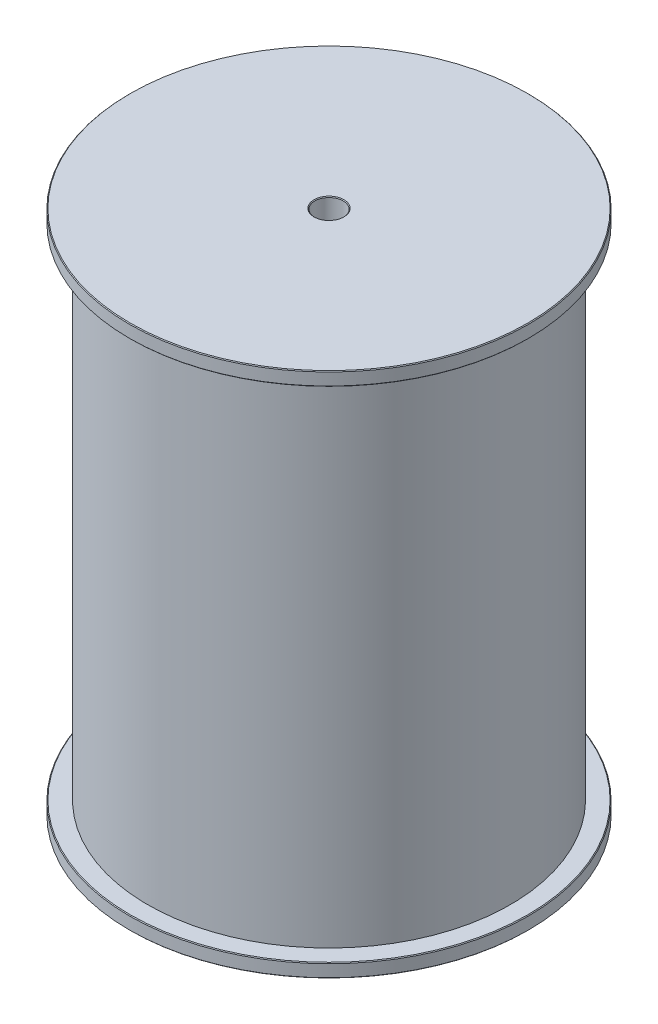
ISO-10303-21;
HEADER;
FILE_DESCRIPTION(('STEP AP214'),'2;1');
FILE_NAME('part.step','',(''),(''),'','','');
FILE_SCHEMA(('AUTOMOTIVE_DESIGN { 1 0 10303 214 1 1 1 1 }'));
ENDSEC;
DATA;
#1=APPLICATION_CONTEXT('core data for automotive mechanical design processes');
#2=APPLICATION_PROTOCOL_DEFINITION('international standard','automotive_design',2000,#1);
#3=PRODUCT_CONTEXT('',#1,'mechanical');
#4=PRODUCT('Part','Part','',(#3));
#5=PRODUCT_RELATED_PRODUCT_CATEGORY('part','',(#4));
#6=PRODUCT_DEFINITION_FORMATION('','',#4);
#7=PRODUCT_DEFINITION_CONTEXT('part definition',#1,'design');
#8=PRODUCT_DEFINITION('design','',#6,#7);
#9=PRODUCT_DEFINITION_SHAPE('','',#8);
#10=(LENGTH_UNIT() NAMED_UNIT(*) SI_UNIT(.MILLI.,.METRE.));
#11=(NAMED_UNIT(*) PLANE_ANGLE_UNIT() SI_UNIT($,.RADIAN.));
#12=(NAMED_UNIT(*) SI_UNIT($,.STERADIAN.) SOLID_ANGLE_UNIT());
#13=UNCERTAINTY_MEASURE_WITH_UNIT(LENGTH_MEASURE(1.E-05),#10,'distance_accuracy_value','');
#14=(GEOMETRIC_REPRESENTATION_CONTEXT(3) GLOBAL_UNCERTAINTY_ASSIGNED_CONTEXT((#13)) GLOBAL_UNIT_ASSIGNED_CONTEXT((#10,
#11,#12)) REPRESENTATION_CONTEXT('',''));
#15=CARTESIAN_POINT('',(0.,0.,0.));
#16=DIRECTION('',(0.,0.,1.));
#17=DIRECTION('',(1.,0.,0.));
#18=AXIS2_PLACEMENT_3D('',#15,#16,#17);
#19=CARTESIAN_POINT('',(0.,92.075,0.));
#20=DIRECTION('',(0.,1.,0.));
#21=DIRECTION('',(-1.,0.,0.));
#22=AXIS2_PLACEMENT_3D('',#19,#20,#21);
#23=CYLINDRICAL_SURFACE('',#22,2.48920000000001);
#24=CARTESIAN_POINT('',(0.,0.12700000000003,0.));
#25=DIRECTION('',(0.,1.,0.));
#26=DIRECTION('',(-1.,0.,0.));
#27=AXIS2_PLACEMENT_3D('',#24,#25,#26);
#28=CIRCLE('',#27,2.48920000000001);
#29=CARTESIAN_POINT('',(2.48920000000001,0.12700000000003,0.));
#30=VERTEX_POINT('',#29);
#31=EDGE_CURVE('E61',#30,#30,#28,.F.);
#32=ORIENTED_EDGE('',*,*,#31,.T.);
#33=EDGE_LOOP('',(#32));
#34=FACE_BOUND('',#33,.T.);
#35=CARTESIAN_POINT('',(0.,91.948,0.));
#36=DIRECTION('',(0.,-1.,0.));
#37=DIRECTION('',(1.,0.,0.));
#38=AXIS2_PLACEMENT_3D('',#35,#36,#37);
#39=CIRCLE('',#38,2.48920000000001);
#40=CARTESIAN_POINT('',(2.48920000000001,91.948,0.));
#41=VERTEX_POINT('',#40);
#42=EDGE_CURVE('E66',#41,#41,#39,.F.);
#43=ORIENTED_EDGE('',*,*,#42,.T.);
#44=EDGE_LOOP('',(#43));
#45=FACE_BOUND('',#44,.T.);
#46=ADVANCED_FACE('F47',(#34,#45),#23,.F.);
#47=CARTESIAN_POINT('',(0.,0.,0.));
#48=DIRECTION('',(0.,1.,0.));
#49=DIRECTION('',(-1.,0.,0.));
#50=AXIS2_PLACEMENT_3D('',#47,#48,#49);
#51=PLANE('',#50);
#52=CARTESIAN_POINT('',(0.,0.,0.));
#53=DIRECTION('',(0.,1.,0.));
#54=DIRECTION('',(-1.,0.,0.));
#55=AXIS2_PLACEMENT_3D('',#52,#53,#54);
#56=CIRCLE('',#55,34.798);
#57=CARTESIAN_POINT('',(-34.798,0.,0.));
#58=VERTEX_POINT('',#57);
#59=EDGE_CURVE('E72',#58,#58,#56,.F.);
#60=ORIENTED_EDGE('',*,*,#59,.T.);
#61=EDGE_LOOP('',(#60));
#62=FACE_BOUND('',#61,.T.);
#63=CARTESIAN_POINT('',(0.,0.,0.));
#64=DIRECTION('',(0.,1.,0.));
#65=DIRECTION('',(-1.,0.,0.));
#66=AXIS2_PLACEMENT_3D('',#63,#64,#65);
#67=CIRCLE('',#66,2.61620000000003);
#68=CARTESIAN_POINT('',(2.61620000000003,0.,0.));
#69=VERTEX_POINT('',#68);
#70=EDGE_CURVE('E76',#69,#69,#67,.T.);
#71=ORIENTED_EDGE('',*,*,#70,.T.);
#72=EDGE_LOOP('',(#71));
#73=FACE_BOUND('',#72,.T.);
#74=ADVANCED_FACE('F130',(#62,#73),#51,.F.);
#75=CARTESIAN_POINT('',(0.,92.075,0.));
#76=DIRECTION('',(0.,1.,0.));
#77=DIRECTION('',(-1.,0.,0.));
#78=AXIS2_PLACEMENT_3D('',#75,#76,#77);
#79=CYLINDRICAL_SURFACE('',#78,34.925);
#80=CARTESIAN_POINT('',(0.,2.25425000000005,0.));
#81=DIRECTION('',(0.,-1.,0.));
#82=DIRECTION('',(1.,0.,0.));
#83=AXIS2_PLACEMENT_3D('',#80,#81,#82);
#84=CIRCLE('',#83,34.925);
#85=CARTESIAN_POINT('',(34.925,2.25425000000006,0.));
#86=VERTEX_POINT('',#85);
#87=EDGE_CURVE('E80',#86,#86,#84,.T.);
#88=ORIENTED_EDGE('',*,*,#87,.T.);
#89=EDGE_LOOP('',(#88));
#90=FACE_BOUND('',#89,.T.);
#91=CARTESIAN_POINT('',(0.,0.127000000000016,0.));
#92=DIRECTION('',(0.,1.,0.));
#93=DIRECTION('',(-1.,0.,0.));
#94=AXIS2_PLACEMENT_3D('',#91,#92,#93);
#95=CIRCLE('',#94,34.925);
#96=CARTESIAN_POINT('',(-34.925,0.127000000000015,0.));
#97=VERTEX_POINT('',#96);
#98=EDGE_CURVE('E84',#97,#97,#95,.T.);
#99=ORIENTED_EDGE('',*,*,#98,.T.);
#100=EDGE_LOOP('',(#99));
#101=FACE_BOUND('',#100,.T.);
#102=ADVANCED_FACE('F123',(#90,#101),#79,.T.);
#103=CARTESIAN_POINT('',(0.,2.38125,0.));
#104=DIRECTION('',(0.,-1.,0.));
#105=DIRECTION('',(1.,0.,0.));
#106=AXIS2_PLACEMENT_3D('',#103,#104,#105);
#107=PLANE('',#106);
#108=CARTESIAN_POINT('',(0.,2.38125,0.));
#109=DIRECTION('',(0.,-1.,0.));
#110=DIRECTION('',(1.,0.,0.));
#111=AXIS2_PLACEMENT_3D('',#108,#109,#110);
#112=CIRCLE('',#111,34.798);
#113=CARTESIAN_POINT('',(34.798,2.38125,0.));
#114=VERTEX_POINT('',#113);
#115=EDGE_CURVE('E88',#114,#114,#112,.F.);
#116=ORIENTED_EDGE('',*,*,#115,.T.);
#117=EDGE_LOOP('',(#116));
#118=FACE_BOUND('',#117,.T.);
#119=CARTESIAN_POINT('',(0.,2.38125,0.));
#120=DIRECTION('',(0.,1.,0.));
#121=DIRECTION('',(-1.,0.,0.));
#122=AXIS2_PLACEMENT_3D('',#119,#120,#121);
#123=CIRCLE('',#122,31.75);
#124=CARTESIAN_POINT('',(-31.75,2.38125,0.));
#125=VERTEX_POINT('',#124);
#126=EDGE_CURVE('E104',#125,#125,#123,.T.);
#127=ORIENTED_EDGE('',*,*,#126,.F.);
#128=EDGE_LOOP('',(#127));
#129=FACE_BOUND('',#128,.T.);
#130=ADVANCED_FACE('F118',(#118,#129),#107,.F.);
#131=CARTESIAN_POINT('',(0.,92.075,0.));
#132=DIRECTION('',(0.,1.,0.));
#133=DIRECTION('',(-1.,0.,0.));
#134=AXIS2_PLACEMENT_3D('',#131,#132,#133);
#135=CYLINDRICAL_SURFACE('',#134,31.75);
#136=CARTESIAN_POINT('',(0.,89.69375,0.));
#137=DIRECTION('',(0.,1.,0.));
#138=DIRECTION('',(-1.,0.,0.));
#139=AXIS2_PLACEMENT_3D('',#136,#137,#138);
#140=CIRCLE('',#139,31.75);
#141=CARTESIAN_POINT('',(-31.75,89.69375,0.));
#142=VERTEX_POINT('',#141);
#143=EDGE_CURVE('E108',#142,#142,#140,.T.);
#144=ORIENTED_EDGE('',*,*,#143,.F.);
#145=EDGE_LOOP('',(#144));
#146=FACE_BOUND('',#145,.T.);
#147=ORIENTED_EDGE('',*,*,#126,.T.);
#148=EDGE_LOOP('',(#147));
#149=FACE_BOUND('',#148,.T.);
#150=ADVANCED_FACE('F115',(#146,#149),#135,.T.);
#151=CARTESIAN_POINT('',(0.,89.69375,0.));
#152=DIRECTION('',(0.,1.,0.));
#153=DIRECTION('',(-1.,0.,0.));
#154=AXIS2_PLACEMENT_3D('',#151,#152,#153);
#155=PLANE('',#154);
#156=CARTESIAN_POINT('',(0.,89.69375,0.));
#157=DIRECTION('',(0.,1.,0.));
#158=DIRECTION('',(-1.,0.,0.));
#159=AXIS2_PLACEMENT_3D('',#156,#157,#158);
#160=CIRCLE('',#159,34.798);
#161=CARTESIAN_POINT('',(-34.798,89.69375,0.));
#162=VERTEX_POINT('',#161);
#163=EDGE_CURVE('E92',#162,#162,#160,.F.);
#164=ORIENTED_EDGE('',*,*,#163,.T.);
#165=EDGE_LOOP('',(#164));
#166=FACE_BOUND('',#165,.T.);
#167=ORIENTED_EDGE('',*,*,#143,.T.);
#168=EDGE_LOOP('',(#167));
#169=FACE_BOUND('',#168,.T.);
#170=ADVANCED_FACE('F113',(#166,#169),#155,.F.);
#171=CARTESIAN_POINT('',(0.,92.075,0.));
#172=DIRECTION('',(0.,1.,0.));
#173=DIRECTION('',(-1.,0.,0.));
#174=AXIS2_PLACEMENT_3D('',#171,#172,#173);
#175=CYLINDRICAL_SURFACE('',#174,34.925);
#176=CARTESIAN_POINT('',(0.,89.82075,0.));
#177=DIRECTION('',(0.,1.,0.));
#178=DIRECTION('',(-1.,0.,0.));
#179=AXIS2_PLACEMENT_3D('',#176,#177,#178);
#180=CIRCLE('',#179,34.925);
#181=CARTESIAN_POINT('',(-34.925,89.82075,0.));
#182=VERTEX_POINT('',#181);
#183=EDGE_CURVE('E96',#182,#182,#180,.T.);
#184=ORIENTED_EDGE('',*,*,#183,.T.);
#185=EDGE_LOOP('',(#184));
#186=FACE_BOUND('',#185,.T.);
#187=CARTESIAN_POINT('',(0.,91.9480000000001,0.));
#188=DIRECTION('',(0.,-1.,0.));
#189=DIRECTION('',(1.,0.,0.));
#190=AXIS2_PLACEMENT_3D('',#187,#188,#189);
#191=CIRCLE('',#190,34.925);
#192=CARTESIAN_POINT('',(34.925,91.9480000000001,0.));
#193=VERTEX_POINT('',#192);
#194=EDGE_CURVE('E100',#193,#193,#191,.T.);
#195=ORIENTED_EDGE('',*,*,#194,.T.);
#196=EDGE_LOOP('',(#195));
#197=FACE_BOUND('',#196,.T.);
#198=ADVANCED_FACE('F184',(#186,#197),#175,.T.);
#199=CARTESIAN_POINT('',(0.,92.075,0.));
#200=DIRECTION('',(0.,-1.,0.));
#201=DIRECTION('',(1.,0.,0.));
#202=AXIS2_PLACEMENT_3D('',#199,#200,#201);
#203=PLANE('',#202);
#204=CARTESIAN_POINT('',(0.,92.075,0.));
#205=DIRECTION('',(0.,-1.,0.));
#206=DIRECTION('',(1.,0.,0.));
#207=AXIS2_PLACEMENT_3D('',#204,#205,#206);
#208=CIRCLE('',#207,34.798);
#209=CARTESIAN_POINT('',(34.798,92.075,0.));
#210=VERTEX_POINT('',#209);
#211=EDGE_CURVE('E10',#210,#210,#208,.F.);
#212=ORIENTED_EDGE('',*,*,#211,.T.);
#213=EDGE_LOOP('',(#212));
#214=FACE_BOUND('',#213,.T.);
#215=CARTESIAN_POINT('',(0.,92.075,0.));
#216=DIRECTION('',(0.,-1.,0.));
#217=DIRECTION('',(1.,0.,0.));
#218=AXIS2_PLACEMENT_3D('',#215,#216,#217);
#219=CIRCLE('',#218,2.61620000000003);
#220=CARTESIAN_POINT('',(2.61620000000003,92.075,0.));
#221=VERTEX_POINT('',#220);
#222=EDGE_CURVE('E56',#221,#221,#219,.T.);
#223=ORIENTED_EDGE('',*,*,#222,.T.);
#224=EDGE_LOOP('',(#223));
#225=FACE_BOUND('',#224,.T.);
#226=ADVANCED_FACE('F151',(#214,#225),#203,.F.);
#227=CARTESIAN_POINT('',(0.,89.82075,0.));
#228=DIRECTION('',(0.,1.,0.));
#229=DIRECTION('',(-1.,0.,0.));
#230=AXIS2_PLACEMENT_3D('',#227,#228,#229);
#231=CONICAL_SURFACE('',#230,34.925,0.785398163397476);
#232=ORIENTED_EDGE('',*,*,#163,.F.);
#233=EDGE_LOOP('',(#232));
#234=FACE_BOUND('',#233,.T.);
#235=ORIENTED_EDGE('',*,*,#183,.F.);
#236=EDGE_LOOP('',(#235));
#237=FACE_BOUND('',#236,.T.);
#238=ADVANCED_FACE('F144',(#234,#237),#231,.T.);
#239=CARTESIAN_POINT('',(0.,2.38125,0.));
#240=DIRECTION('',(0.,-1.,0.));
#241=DIRECTION('',(1.,0.,0.));
#242=AXIS2_PLACEMENT_3D('',#239,#240,#241);
#243=CONICAL_SURFACE('',#242,34.798,0.785398163397476);
#244=ORIENTED_EDGE('',*,*,#87,.F.);
#245=EDGE_LOOP('',(#244));
#246=FACE_BOUND('',#245,.T.);
#247=ORIENTED_EDGE('',*,*,#115,.F.);
#248=EDGE_LOOP('',(#247));
#249=FACE_BOUND('',#248,.T.);
#250=ADVANCED_FACE('F150',(#246,#249),#243,.T.);
#251=CARTESIAN_POINT('',(0.,0.127000000000016,0.));
#252=DIRECTION('',(0.,1.,0.));
#253=DIRECTION('',(-1.,0.,0.));
#254=AXIS2_PLACEMENT_3D('',#251,#252,#253);
#255=CONICAL_SURFACE('',#254,34.925,0.785398163397448);
#256=ORIENTED_EDGE('',*,*,#59,.F.);
#257=EDGE_LOOP('',(#256));
#258=FACE_BOUND('',#257,.T.);
#259=ORIENTED_EDGE('',*,*,#98,.F.);
#260=EDGE_LOOP('',(#259));
#261=FACE_BOUND('',#260,.T.);
#262=ADVANCED_FACE('F158',(#258,#261),#255,.T.);
#263=CARTESIAN_POINT('',(0.,0.,0.));
#264=DIRECTION('',(0.,-1.,0.));
#265=DIRECTION('',(1.,0.,0.));
#266=AXIS2_PLACEMENT_3D('',#263,#264,#265);
#267=CONICAL_SURFACE('',#266,2.61620000000003,0.785398163397404);
#268=CARTESIAN_POINT('',(2.48920000000001,0.12700000000003,0.));
#269=CARTESIAN_POINT('',(2.49052291666667,0.125677083333363,0.));
#270=CARTESIAN_POINT('',(2.49184583333334,0.124354166666696,0.));
#271=CARTESIAN_POINT('',(2.49449166666668,0.121708333333362,0.));
#272=CARTESIAN_POINT('',(2.49581458333334,0.120385416666695,0.));
#273=CARTESIAN_POINT('',(2.49846041666668,0.117739583333361,0.));
#274=CARTESIAN_POINT('',(2.49978333333334,0.116416666666694,0.));
#275=CARTESIAN_POINT('',(2.50242916666668,0.11377083333336,0.));
#276=CARTESIAN_POINT('',(2.50375208333334,0.112447916666693,0.));
#277=CARTESIAN_POINT('',(2.50639791666668,0.109802083333359,0.));
#278=CARTESIAN_POINT('',(2.50772083333334,0.108479166666692,0.));
#279=CARTESIAN_POINT('',(2.51036666666668,0.105833333333358,0.));
#280=CARTESIAN_POINT('',(2.51168958333334,0.104510416666691,0.));
#281=CARTESIAN_POINT('',(2.51433541666668,0.101864583333357,0.));
#282=CARTESIAN_POINT('',(2.51565833333335,0.10054166666669,0.));
#283=CARTESIAN_POINT('',(2.51830416666668,0.0978958333333563,0.));
#284=CARTESIAN_POINT('',(2.51962708333335,0.0965729166666894,0.));
#285=CARTESIAN_POINT('',(2.52227291666668,0.0939270833333555,0.));
#286=CARTESIAN_POINT('',(2.52359583333335,0.0926041666666884,0.));
#287=CARTESIAN_POINT('',(2.52624166666668,0.0899583333333545,0.));
#288=CARTESIAN_POINT('',(2.52756458333335,0.0886354166666875,0.));
#289=CARTESIAN_POINT('',(2.53021041666668,0.0859895833333535,0.));
#290=CARTESIAN_POINT('',(2.53153333333335,0.0846666666666866,0.));
#291=CARTESIAN_POINT('',(2.53417916666668,0.0820208333333526,0.));
#292=CARTESIAN_POINT('',(2.53550208333335,0.0806979166666856,0.));
#293=CARTESIAN_POINT('',(2.53814791666668,0.0780520833333516,0.));
#294=CARTESIAN_POINT('',(2.53947083333335,0.0767291666666847,0.));
#295=CARTESIAN_POINT('',(2.54211666666668,0.0740833333333508,0.));
#296=CARTESIAN_POINT('',(2.54343958333335,0.0727604166666837,0.));
#297=CARTESIAN_POINT('',(2.54608541666668,0.0701145833333497,0.));
#298=CARTESIAN_POINT('',(2.54740833333335,0.0687916666666828,0.));
#299=CARTESIAN_POINT('',(2.55005416666668,0.0661458333333488,0.));
#300=CARTESIAN_POINT('',(2.55137708333335,0.0648229166666818,0.));
#301=CARTESIAN_POINT('',(2.55402291666668,0.0621770833333479,0.));
#302=CARTESIAN_POINT('',(2.55534583333335,0.0608541666666808,0.));
#303=CARTESIAN_POINT('',(2.55799166666668,0.0582083333333469,0.));
#304=CARTESIAN_POINT('',(2.55931458333335,0.05688541666668,0.));
#305=CARTESIAN_POINT('',(2.56196041666669,0.054239583333346,0.));
#306=CARTESIAN_POINT('',(2.56328333333335,0.052916666666679,0.));
#307=CARTESIAN_POINT('',(2.56592916666669,0.050270833333345,0.));
#308=CARTESIAN_POINT('',(2.56725208333335,0.0489479166666781,0.));
#309=CARTESIAN_POINT('',(2.56989791666669,0.0463020833333441,0.));
#310=CARTESIAN_POINT('',(2.57122083333335,0.0449791666666771,0.));
#311=CARTESIAN_POINT('',(2.57386666666669,0.0423333333333431,0.));
#312=CARTESIAN_POINT('',(2.57518958333335,0.0410104166666761,0.));
#313=CARTESIAN_POINT('',(2.57783541666669,0.0383645833333422,0.));
#314=CARTESIAN_POINT('',(2.57915833333336,0.0370416666666753,0.));
#315=CARTESIAN_POINT('',(2.58180416666669,0.0343958333333413,0.));
#316=CARTESIAN_POINT('',(2.58312708333336,0.0330729166666743,0.));
#317=CARTESIAN_POINT('',(2.58577291666669,0.0304270833333403,0.));
#318=CARTESIAN_POINT('',(2.58709583333336,0.0291041666666734,0.));
#319=CARTESIAN_POINT('',(2.58974166666669,0.0264583333333394,0.));
#320=CARTESIAN_POINT('',(2.59106458333336,0.0251354166666724,0.));
#321=CARTESIAN_POINT('',(2.59371041666669,0.0224895833333384,0.));
#322=CARTESIAN_POINT('',(2.59503333333336,0.0211666666666715,0.));
#323=CARTESIAN_POINT('',(2.59767916666669,0.0185208333333375,0.));
#324=CARTESIAN_POINT('',(2.59900208333336,0.0171979166666705,0.));
#325=CARTESIAN_POINT('',(2.60164791666669,0.0145520833333365,0.));
#326=CARTESIAN_POINT('',(2.60297083333336,0.0132291666666696,0.));
#327=CARTESIAN_POINT('',(2.60561666666669,0.0105833333333356,0.));
#328=CARTESIAN_POINT('',(2.60693958333336,0.00926041666666865,0.));
#329=CARTESIAN_POINT('',(2.60958541666669,0.00661458333333467,0.));
#330=CARTESIAN_POINT('',(2.61090833333336,0.00529166666666766,0.));
#331=CARTESIAN_POINT('',(2.61355416666669,0.00264583333333367,0.));
#332=CARTESIAN_POINT('',(2.61487708333336,0.00132291666666667,0.));
#333=CARTESIAN_POINT('',(2.61620000000003,0.,0.));
#334=B_SPLINE_CURVE_WITH_KNOTS('',3,(#268,#269,#270,#271,#272,#273,#274,#275,#276,#277,#278,
#279,#280,#281,#282,#283,#284,#285,#286,#287,#288,#289,#290,#291,#292,#293,#294,#295,#296,#297,
#298,#299,#300,#301,#302,#303,#304,#305,#306,#307,#308,#309,#310,#311,#312,#313,#314,#315,#316,
#317,#318,#319,#320,#321,#322,#323,#324,#325,#326,#327,#328,#329,#330,#331,#332,#333),
.UNSPECIFIED.,.F.,.F.,(4,2,2,2,2,2,2,2,2,2,2,2,2,2,2,2,2,2,2,2,2,2,2,2,2,2,2,2,2,2,2,2,4),(0.,
0.00561266007566923,0.0112253201513385,0.0168379802270077,0.0224506403026773,0.0280633003783465,
0.0336759604540157,0.039288620529685,0.0449012806053545,0.0505139406810238,0.056126600756693,
0.0617392608323623,0.0673519209080315,0.0729645809837011,0.0785772410593703,0.0841899011350395,
0.0898025612107088,0.095415221286378,0.101027881362048,0.106640541437717,0.112253201513386,
0.117865861589055,0.123478521664725,0.129091181740394,0.134703841816063,0.140316501891733,
0.145929161967402,0.151541822043071,0.157154482118741,0.16276714219441,0.168379802270079,
0.173992462345748,0.179605122421418),.UNSPECIFIED.);
#335=EDGE_CURVE('BSEAM165',#30,#69,#334,.T.);
#336=ORIENTED_EDGE('',*,*,#31,.F.);
#337=ORIENTED_EDGE('',*,*,#70,.F.);
#338=ORIENTED_EDGE('',*,*,#335,.T.);
#339=ORIENTED_EDGE('',*,*,#335,.F.);
#340=EDGE_LOOP('',(#336,#338,#337,#339));
#341=FACE_BOUND('',#340,.T.);
#342=ADVANCED_FACE('F165',(#341),#267,.F.);
#343=CARTESIAN_POINT('',(0.,92.075,0.));
#344=DIRECTION('',(0.,-1.,0.));
#345=DIRECTION('',(1.,0.,0.));
#346=AXIS2_PLACEMENT_3D('',#343,#344,#345);
#347=CONICAL_SURFACE('',#346,34.798,0.78539816339753);
#348=ORIENTED_EDGE('',*,*,#194,.F.);
#349=EDGE_LOOP('',(#348));
#350=FACE_BOUND('',#349,.T.);
#351=ORIENTED_EDGE('',*,*,#211,.F.);
#352=EDGE_LOOP('',(#351));
#353=FACE_BOUND('',#352,.T.);
#354=ADVANCED_FACE('F171',(#350,#353),#347,.T.);
#355=CARTESIAN_POINT('',(0.,91.948,0.));
#356=DIRECTION('',(0.,1.,0.));
#357=DIRECTION('',(-1.,0.,0.));
#358=AXIS2_PLACEMENT_3D('',#355,#356,#357);
#359=CONICAL_SURFACE('',#358,2.48920000000001,0.785398163397458);
#360=ORIENTED_EDGE('',*,*,#222,.F.);
#361=EDGE_LOOP('',(#360));
#362=FACE_BOUND('',#361,.T.);
#363=ORIENTED_EDGE('',*,*,#42,.F.);
#364=EDGE_LOOP('',(#363));
#365=FACE_BOUND('',#364,.T.);
#366=ADVANCED_FACE('F50',(#362,#365),#359,.F.);
#367=CLOSED_SHELL('',(#46,#74,#102,#130,#150,#170,#198,#226,#238,#250,#262,#342,#354,#366));
#368=MANIFOLD_SOLID_BREP('B2',#367);
#369=ADVANCED_BREP_SHAPE_REPRESENTATION('',(#18,#368),#14);
#370=SHAPE_DEFINITION_REPRESENTATION(#9,#369);
ENDSEC;
END-ISO-10303-21;
